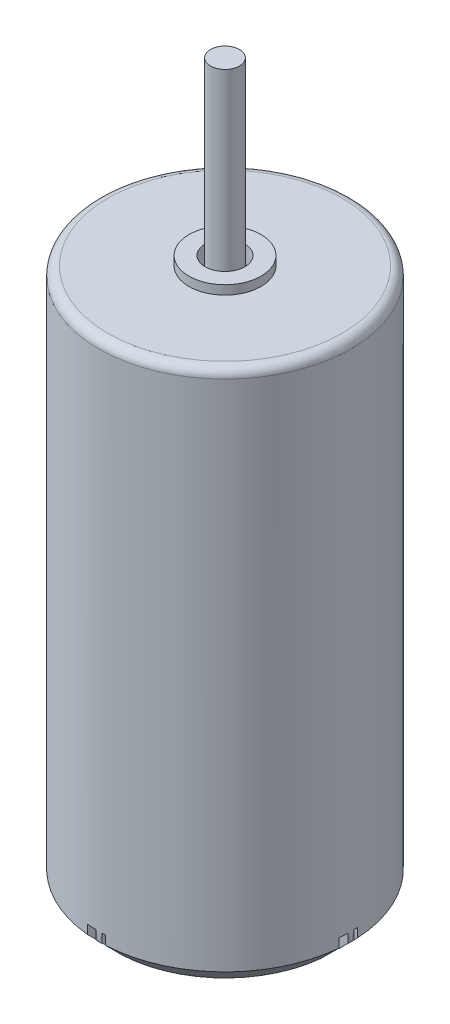
ISO-10303-21;
HEADER;
FILE_DESCRIPTION(('STEP AP214'),'2;1');
FILE_NAME('part.step','',(''),(''),'','','');
FILE_SCHEMA(('AUTOMOTIVE_DESIGN { 1 0 10303 214 1 1 1 1 }'));
ENDSEC;
DATA;
#1=APPLICATION_CONTEXT('core data for automotive mechanical design processes');
#2=APPLICATION_PROTOCOL_DEFINITION('international standard','automotive_design',2000,#1);
#3=PRODUCT_CONTEXT('',#1,'mechanical');
#4=PRODUCT('Part','Part','',(#3));
#5=PRODUCT_RELATED_PRODUCT_CATEGORY('part','',(#4));
#6=PRODUCT_DEFINITION_FORMATION('','',#4);
#7=PRODUCT_DEFINITION_CONTEXT('part definition',#1,'design');
#8=PRODUCT_DEFINITION('design','',#6,#7);
#9=PRODUCT_DEFINITION_SHAPE('','',#8);
#10=(LENGTH_UNIT() NAMED_UNIT(*) SI_UNIT(.MILLI.,.METRE.));
#11=(NAMED_UNIT(*) PLANE_ANGLE_UNIT() SI_UNIT($,.RADIAN.));
#12=(NAMED_UNIT(*) SI_UNIT($,.STERADIAN.) SOLID_ANGLE_UNIT());
#13=UNCERTAINTY_MEASURE_WITH_UNIT(LENGTH_MEASURE(1.E-05),#10,'distance_accuracy_value','');
#14=(GEOMETRIC_REPRESENTATION_CONTEXT(3) GLOBAL_UNCERTAINTY_ASSIGNED_CONTEXT((#13)) GLOBAL_UNIT_ASSIGNED_CONTEXT((#10,
#11,#12)) REPRESENTATION_CONTEXT('',''));
#15=CARTESIAN_POINT('',(0.,0.,0.));
#16=DIRECTION('',(0.,0.,1.));
#17=DIRECTION('',(1.,0.,0.));
#18=AXIS2_PLACEMENT_3D('',#15,#16,#17);
#19=CARTESIAN_POINT('',(0.,0.,0.));
#20=DIRECTION('',(0.,1.,0.));
#21=DIRECTION('',(0.,0.,1.));
#22=AXIS2_PLACEMENT_3D('',#19,#20,#21);
#23=CONICAL_SURFACE('',#22,3.00000000000001,0.785398163397443);
#24=CARTESIAN_POINT('',(0.17527236331454,-1.11823398874989,1.87358557844427));
#25=CARTESIAN_POINT('',(0.175272363314539,-0.858946175686396,2.13393247003533));
#26=CARTESIAN_POINT('',(0.175272363314538,-0.599509125002634,2.39413053381341));
#27=CARTESIAN_POINT('',(0.175272363314537,-0.0804534282997025,2.9143454084042));
#28=CARTESIAN_POINT('',(0.175272363314536,0.179165217688184,3.1743622192481));
#29=CARTESIAN_POINT('',(0.175272363314534,0.635354890827164,3.63113762261169));
#30=CARTESIAN_POINT('',(0.175272363314533,0.83191208048382,3.82791004320748));
#31=CARTESIAN_POINT('',(0.175272363314532,1.22505439379513,4.22142702032182));
#32=CARTESIAN_POINT('',(0.175272363314531,1.42163951745283,4.41817157683734));
#33=CARTESIAN_POINT('',(0.175272363314531,1.61823398874989,4.61490680008847));
#34=B_SPLINE_CURVE_WITH_KNOTS('',3,(#24,#25,#26,#27,#28,#29,#30,#31,#32,#33),.UNSPECIFIED.,.F.,
.F.,(4,2,2,2,4),(0.,1.10231370844078,2.2046272270411,3.03900546012019,3.87338378422473),.UNSPECIFIED.);
#35=CARTESIAN_POINT('',(0.175272363314536,0.,2.99487555645609));
#36=VERTEX_POINT('',#35);
#37=CARTESIAN_POINT('',(0.175272363314535,0.499999999999998,3.49560861634396));
#38=VERTEX_POINT('',#37);
#39=EDGE_CURVE('E633',#36,#38,#34,.T.);
#40=ORIENTED_EDGE('',*,*,#39,.F.);
#41=CARTESIAN_POINT('',(0.,0.,0.));
#42=DIRECTION('',(0.,-1.,0.));
#43=DIRECTION('',(0.,0.,-1.));
#44=AXIS2_PLACEMENT_3D('',#41,#42,#43);
#45=CIRCLE('',#44,3.00000000000001);
#46=CARTESIAN_POINT('',(2.98237354500953,0.,0.324727636685453));
#47=VERTEX_POINT('',#46);
#48=EDGE_CURVE('E516',#47,#36,#45,.T.);
#49=ORIENTED_EDGE('',*,*,#48,.F.);
#50=CARTESIAN_POINT('',(4.6068033533913,1.61823398874989,0.324727636685453));
#51=CARTESIAN_POINT('',(4.37777151372004,1.38978566009453,0.324727636685453));
#52=CARTESIAN_POINT('',(4.14871311811422,1.16136388663444,0.324727636685453));
#53=CARTESIAN_POINT('',(3.69045593135217,0.704662018285365,0.324727636685453));
#54=CARTESIAN_POINT('',(3.46125714043768,0.476381923153808,0.324727636685453));
#55=CARTESIAN_POINT('',(3.00263065589193,0.0200507591434692,0.324727636685453));
#56=CARTESIAN_POINT('',(2.77320296182466,-0.208000309297399,0.324727636685453));
#57=CARTESIAN_POINT('',(2.42870895506907,-0.549722189765074,0.324727636685453));
#58=CARTESIAN_POINT('',(2.31381877268379,-0.663570464169604,0.324727636685453));
#59=CARTESIAN_POINT('',(2.08384315728114,-0.891069865080979,0.324727636685453));
#60=CARTESIAN_POINT('',(1.96875772403218,-1.00472099135367,0.324727636685453));
#61=CARTESIAN_POINT('',(1.85353588664177,-1.11823398874989,0.324727636685453));
#62=B_SPLINE_CURVE_WITH_KNOTS('',3,(#50,#51,#52,#53,#54,#55,#56,#57,#58,#59,#60,#61),
.UNSPECIFIED.,.F.,.F.,(4,2,2,2,2,4),(0.,0.970462841139808,1.94092401607462,2.91138704307374,
3.39661942125925,3.88185237537383),.UNSPECIFIED.);
#63=CARTESIAN_POINT('',(3.48490343653489,0.499999999999999,0.324727636685453));
#64=VERTEX_POINT('',#63);
#65=EDGE_CURVE('E511',#64,#47,#62,.T.);
#66=ORIENTED_EDGE('',*,*,#65,.F.);
#67=CARTESIAN_POINT('',(0.,0.499999999999999,0.));
#68=DIRECTION('',(0.,-1.,0.));
#69=DIRECTION('',(0.,0.,-1.));
#70=AXIS2_PLACEMENT_3D('',#67,#68,#69);
#71=CIRCLE('',#70,3.5);
#72=EDGE_CURVE('E512',#38,#64,#71,.F.);
#73=ORIENTED_EDGE('',*,*,#72,.F.);
#74=EDGE_LOOP('',(#40,#49,#66,#73));
#75=FACE_BOUND('',#74,.T.);
#76=ADVANCED_FACE('F47',(#75),#23,.T.);
#77=CARTESIAN_POINT('',(-0.324727636685469,1.61823398874989,4.6068033533913));
#78=CARTESIAN_POINT('',(-0.324727636685469,1.38978566009453,4.37777151372004));
#79=CARTESIAN_POINT('',(-0.324727636685468,1.16136388663444,4.14871311811422));
#80=CARTESIAN_POINT('',(-0.324727636685466,0.704662018285365,3.69045593135217));
#81=CARTESIAN_POINT('',(-0.324727636685465,0.476381923153809,3.46125714043768));
#82=CARTESIAN_POINT('',(-0.324727636685464,0.0200507591434701,3.00263065589193));
#83=CARTESIAN_POINT('',(-0.324727636685463,-0.208000309297398,2.77320296182466));
#84=CARTESIAN_POINT('',(-0.324727636685462,-0.549722189765073,2.42870895506907));
#85=CARTESIAN_POINT('',(-0.324727636685461,-0.663570464169602,2.31381877268379));
#86=CARTESIAN_POINT('',(-0.324727636685461,-0.891069865080978,2.08384315728114));
#87=CARTESIAN_POINT('',(-0.32472763668546,-1.00472099135367,1.96875772403218));
#88=CARTESIAN_POINT('',(-0.32472763668546,-1.11823398874989,1.85353588664177));
#89=B_SPLINE_CURVE_WITH_KNOTS('',3,(#77,#78,#79,#80,#81,#82,#83,#84,#85,#86,#87,#88),
.UNSPECIFIED.,.F.,.F.,(4,2,2,2,2,4),(0.,0.970462841139808,1.94092401607462,2.91138704307374,
3.39661942125925,3.88185237537383),.UNSPECIFIED.);
#90=CARTESIAN_POINT('',(-0.324727636685465,0.499999999999999,3.48490343653489));
#91=VERTEX_POINT('',#90);
#92=CARTESIAN_POINT('',(-0.324727636685464,0.,2.98237354500953));
#93=VERTEX_POINT('',#92);
#94=EDGE_CURVE('E436',#91,#93,#89,.T.);
#95=ORIENTED_EDGE('',*,*,#94,.F.);
#96=CARTESIAN_POINT('',(-3.49560861634396,0.499999999999999,0.175272363314547));
#97=VERTEX_POINT('',#96);
#98=EDGE_CURVE('E506',#97,#91,#71,.F.);
#99=ORIENTED_EDGE('',*,*,#98,.F.);
#100=CARTESIAN_POINT('',(-1.87358557844427,-1.11823398874989,0.175272363314547));
#101=CARTESIAN_POINT('',(-2.13393247003533,-0.858946175686397,0.175272363314547));
#102=CARTESIAN_POINT('',(-2.39413053381341,-0.599509125002634,0.175272363314547));
#103=CARTESIAN_POINT('',(-2.91434540840419,-0.0804534282997024,0.175272363314547));
#104=CARTESIAN_POINT('',(-3.1743622192481,0.179165217688184,0.175272363314547));
#105=CARTESIAN_POINT('',(-3.63113762261169,0.635354890827164,0.175272363314547));
#106=CARTESIAN_POINT('',(-3.82791004320748,0.831912080483821,0.175272363314547));
#107=CARTESIAN_POINT('',(-4.22142702032182,1.22505439379513,0.175272363314547));
#108=CARTESIAN_POINT('',(-4.41817157683734,1.42163951745283,0.175272363314547));
#109=CARTESIAN_POINT('',(-4.61490680008847,1.61823398874989,0.175272363314547));
#110=B_SPLINE_CURVE_WITH_KNOTS('',3,(#100,#101,#102,#103,#104,#105,#106,#107,#108,#109),
.UNSPECIFIED.,.F.,.F.,(4,2,2,2,4),(0.,1.10231370844078,2.2046272270411,3.03900546012019,
3.87338378422473),.UNSPECIFIED.);
#111=CARTESIAN_POINT('',(-2.99487555645609,0.,0.175272363314547));
#112=VERTEX_POINT('',#111);
#113=EDGE_CURVE('E428',#112,#97,#110,.T.);
#114=ORIENTED_EDGE('',*,*,#113,.F.);
#115=EDGE_CURVE('E700',#93,#112,#45,.T.);
#116=ORIENTED_EDGE('',*,*,#115,.F.);
#117=EDGE_LOOP('',(#95,#99,#114,#116));
#118=FACE_BOUND('',#117,.T.);
#119=ADVANCED_FACE('F456',(#118),#23,.T.);
#120=CARTESIAN_POINT('',(-4.6068033533913,1.61823398874989,-0.324727636685453));
#121=CARTESIAN_POINT('',(-4.37777151372004,1.38978566009453,-0.324727636685453));
#122=CARTESIAN_POINT('',(-4.14871311811422,1.16136388663444,-0.324727636685453));
#123=CARTESIAN_POINT('',(-3.69045593135217,0.704662018285365,-0.324727636685453));
#124=CARTESIAN_POINT('',(-3.46125714043768,0.476381923153808,-0.324727636685453));
#125=CARTESIAN_POINT('',(-3.00263065589193,0.0200507591434692,-0.324727636685453));
#126=CARTESIAN_POINT('',(-2.77320296182466,-0.208000309297399,-0.324727636685453));
#127=CARTESIAN_POINT('',(-2.42870895506907,-0.549722189765074,-0.324727636685453));
#128=CARTESIAN_POINT('',(-2.31381877268379,-0.663570464169604,-0.324727636685453));
#129=CARTESIAN_POINT('',(-2.08384315728114,-0.891069865080979,-0.324727636685453));
#130=CARTESIAN_POINT('',(-1.96875772403218,-1.00472099135367,-0.324727636685453));
#131=CARTESIAN_POINT('',(-1.85353588664177,-1.11823398874989,-0.324727636685453));
#132=B_SPLINE_CURVE_WITH_KNOTS('',3,(#120,#121,#122,#123,#124,#125,#126,#127,#128,#129,#130,
#131),.UNSPECIFIED.,.F.,.F.,(4,2,2,2,2,4),(0.,0.970462841139808,1.94092401607462,
2.91138704307374,3.39661942125925,3.88185237537383),.UNSPECIFIED.);
#133=CARTESIAN_POINT('',(-3.48490343653489,0.499999999999999,-0.324727636685453));
#134=VERTEX_POINT('',#133);
#135=CARTESIAN_POINT('',(-2.98237354500953,0.,-0.324727636685453));
#136=VERTEX_POINT('',#135);
#137=EDGE_CURVE('E421',#134,#136,#132,.T.);
#138=ORIENTED_EDGE('',*,*,#137,.F.);
#139=CARTESIAN_POINT('',(-0.17527236331451,0.499999999999999,-3.49560861634396));
#140=VERTEX_POINT('',#139);
#141=EDGE_CURVE('E494',#140,#134,#71,.F.);
#142=ORIENTED_EDGE('',*,*,#141,.F.);
#143=CARTESIAN_POINT('',(-0.175272363314527,-1.11823398874989,-1.87358557844427));
#144=CARTESIAN_POINT('',(-0.175272363314524,-0.858946175686397,-2.13393247003533));
#145=CARTESIAN_POINT('',(-0.175272363314522,-0.599509125002634,-2.39413053381341));
#146=CARTESIAN_POINT('',(-0.175272363314516,-0.0804534282997023,-2.9143454084042));
#147=CARTESIAN_POINT('',(-0.175272363314514,0.179165217688184,-3.1743622192481));
#148=CARTESIAN_POINT('',(-0.175272363314509,0.635354890827164,-3.6311376226117));
#149=CARTESIAN_POINT('',(-0.175272363314507,0.831912080483821,-3.82791004320748));
#150=CARTESIAN_POINT('',(-0.175272363314503,1.22505439379513,-4.22142702032183));
#151=CARTESIAN_POINT('',(-0.1752723633145,1.42163951745283,-4.41817157683735));
#152=CARTESIAN_POINT('',(-0.175272363314498,1.61823398874989,-4.61490680008847));
#153=B_SPLINE_CURVE_WITH_KNOTS('',3,(#143,#144,#145,#146,#147,#148,#149,#150,#151,#152),
.UNSPECIFIED.,.F.,.F.,(4,2,2,2,4),(0.,1.10231370844078,2.2046272270411,3.03900546012019,
3.87338378422473),.UNSPECIFIED.);
#154=CARTESIAN_POINT('',(-0.175272363314515,0.,-2.99487555645609));
#155=VERTEX_POINT('',#154);
#156=EDGE_CURVE('E406',#155,#140,#153,.T.);
#157=ORIENTED_EDGE('',*,*,#156,.F.);
#158=EDGE_CURVE('E496',#136,#155,#45,.T.);
#159=ORIENTED_EDGE('',*,*,#158,.F.);
#160=EDGE_LOOP('',(#138,#142,#157,#159));
#161=FACE_BOUND('',#160,.T.);
#162=ADVANCED_FACE('F462',(#161),#23,.T.);
#163=CARTESIAN_POINT('',(3.5,0.,0.));
#164=DIRECTION('',(0.,-1.,0.));
#165=DIRECTION('',(0.,0.,-1.));
#166=AXIS2_PLACEMENT_3D('',#163,#164,#165);
#167=PLANE('',#166);
#168=DIRECTION('',(0.,0.,1.));
#169=VECTOR('',#168,1.);
#170=CARTESIAN_POINT('',(0.175272363314538,0.,2.49906915230633));
#171=LINE('',#170,#169);
#172=CARTESIAN_POINT('',(0.175272363314538,0.,2.49906915230633));
#173=VERTEX_POINT('',#172);
#174=EDGE_CURVE('E276',#173,#36,#171,.T.);
#175=ORIENTED_EDGE('',*,*,#174,.F.);
#176=DIRECTION('',(1.,0.,0.));
#177=VECTOR('',#176,1.);
#178=CARTESIAN_POINT('',(-0.324727636685462,0.,2.49906915230633));
#179=LINE('',#178,#177);
#180=CARTESIAN_POINT('',(-0.324727636685462,0.,2.49906915230633));
#181=VERTEX_POINT('',#180);
#182=EDGE_CURVE('E272',#181,#173,#179,.T.);
#183=ORIENTED_EDGE('',*,*,#182,.F.);
#184=DIRECTION('',(0.,0.,-1.));
#185=VECTOR('',#184,1.);
#186=CARTESIAN_POINT('',(-0.324727636685462,0.,2.49906915230633));
#187=LINE('',#186,#185);
#188=EDGE_CURVE('E255',#93,#181,#187,.T.);
#189=ORIENTED_EDGE('',*,*,#188,.F.);
#190=ORIENTED_EDGE('',*,*,#115,.T.);
#191=DIRECTION('',(-1.,0.,0.));
#192=VECTOR('',#191,1.);
#193=CARTESIAN_POINT('',(-2.49906915230633,0.,0.175272363314547));
#194=LINE('',#193,#192);
#195=CARTESIAN_POINT('',(-2.49906915230633,0.,0.175272363314547));
#196=VERTEX_POINT('',#195);
#197=EDGE_CURVE('E287',#196,#112,#194,.T.);
#198=ORIENTED_EDGE('',*,*,#197,.F.);
#199=DIRECTION('',(0.,0.,1.));
#200=VECTOR('',#199,1.);
#201=CARTESIAN_POINT('',(-2.49906915230633,0.,-0.324727636685453));
#202=LINE('',#201,#200);
#203=CARTESIAN_POINT('',(-2.49906915230633,0.,-0.324727636685453));
#204=VERTEX_POINT('',#203);
#205=EDGE_CURVE('E302',#204,#196,#202,.T.);
#206=ORIENTED_EDGE('',*,*,#205,.F.);
#207=DIRECTION('',(1.,0.,0.));
#208=VECTOR('',#207,1.);
#209=CARTESIAN_POINT('',(-2.49906915230633,0.,-0.324727636685453));
#210=LINE('',#209,#208);
#211=EDGE_CURVE('E299',#136,#204,#210,.T.);
#212=ORIENTED_EDGE('',*,*,#211,.F.);
#213=ORIENTED_EDGE('',*,*,#158,.T.);
#214=DIRECTION('',(0.,0.,-1.));
#215=VECTOR('',#214,1.);
#216=CARTESIAN_POINT('',(-0.175272363314521,0.,-2.49906915230633));
#217=LINE('',#216,#215);
#218=CARTESIAN_POINT('',(-0.175272363314521,0.,-2.49906915230633));
#219=VERTEX_POINT('',#218);
#220=EDGE_CURVE('E319',#219,#155,#217,.T.);
#221=ORIENTED_EDGE('',*,*,#220,.F.);
#222=DIRECTION('',(-1.,0.,0.));
#223=VECTOR('',#222,1.);
#224=CARTESIAN_POINT('',(0.324727636685479,0.,-2.49906915230633));
#225=LINE('',#224,#223);
#226=CARTESIAN_POINT('',(0.324727636685479,0.,-2.49906915230633));
#227=VERTEX_POINT('',#226);
#228=EDGE_CURVE('E334',#227,#219,#225,.T.);
#229=ORIENTED_EDGE('',*,*,#228,.F.);
#230=DIRECTION('',(0.,0.,1.));
#231=VECTOR('',#230,1.);
#232=CARTESIAN_POINT('',(0.324727636685479,0.,-2.49906915230633));
#233=LINE('',#232,#231);
#234=CARTESIAN_POINT('',(0.324727636685484,0.,-2.98237354500953));
#235=VERTEX_POINT('',#234);
#236=EDGE_CURVE('E331',#235,#227,#233,.T.);
#237=ORIENTED_EDGE('',*,*,#236,.F.);
#238=CARTESIAN_POINT('',(2.99487555645609,0.,-0.175272363314547));
#239=VERTEX_POINT('',#238);
#240=EDGE_CURVE('E688',#235,#239,#45,.T.);
#241=ORIENTED_EDGE('',*,*,#240,.T.);
#242=DIRECTION('',(1.,0.,0.));
#243=VECTOR('',#242,1.);
#244=CARTESIAN_POINT('',(2.49906915230633,0.,-0.175272363314547));
#245=LINE('',#244,#243);
#246=CARTESIAN_POINT('',(2.49906915230633,0.,-0.175272363314547));
#247=VERTEX_POINT('',#246);
#248=EDGE_CURVE('E577',#247,#239,#245,.T.);
#249=ORIENTED_EDGE('',*,*,#248,.F.);
#250=DIRECTION('',(0.,0.,-1.));
#251=VECTOR('',#250,1.);
#252=CARTESIAN_POINT('',(2.49906915230633,0.,0.324727636685453));
#253=LINE('',#252,#251);
#254=CARTESIAN_POINT('',(2.49906915230633,0.,0.324727636685453));
#255=VERTEX_POINT('',#254);
#256=EDGE_CURVE('E582',#255,#247,#253,.T.);
#257=ORIENTED_EDGE('',*,*,#256,.F.);
#258=DIRECTION('',(-1.,0.,0.));
#259=VECTOR('',#258,1.);
#260=CARTESIAN_POINT('',(2.49906915230633,0.,0.324727636685453));
#261=LINE('',#260,#259);
#262=EDGE_CURVE('E586',#47,#255,#261,.T.);
#263=ORIENTED_EDGE('',*,*,#262,.F.);
#264=ORIENTED_EDGE('',*,*,#48,.T.);
#265=EDGE_LOOP('',(#175,#183,#189,#190,#198,#206,#212,#213,#221,#229,#237,#241,#249,#257,#263,#264));
#266=FACE_BOUND('',#265,.T.);
#267=ADVANCED_FACE('F482',(#266),#167,.T.);
#268=CARTESIAN_POINT('',(0.,20.,0.));
#269=DIRECTION('',(0.,1.,0.));
#270=DIRECTION('',(0.,0.,1.));
#271=AXIS2_PLACEMENT_3D('',#268,#269,#270);
#272=PLANE('',#271);
#273=CARTESIAN_POINT('',(0.,20.,0.));
#274=DIRECTION('',(0.,-1.,0.));
#275=DIRECTION('',(0.,0.,-1.));
#276=AXIS2_PLACEMENT_3D('',#273,#274,#275);
#277=CIRCLE('',#276,0.4);
#278=CARTESIAN_POINT('',(0.,20.,-0.4));
#279=VERTEX_POINT('',#278);
#280=EDGE_CURVE('E747',#279,#279,#277,.T.);
#281=ORIENTED_EDGE('',*,*,#280,.F.);
#282=EDGE_LOOP('',(#281));
#283=FACE_BOUND('',#282,.T.);
#284=ADVANCED_FACE('F487',(#283),#272,.T.);
#285=CARTESIAN_POINT('',(0.,0.,0.));
#286=DIRECTION('',(0.,-1.,0.));
#287=DIRECTION('',(0.,0.,-1.));
#288=AXIS2_PLACEMENT_3D('',#285,#286,#287);
#289=CYLINDRICAL_SURFACE('',#288,0.400000000000001);
#290=ORIENTED_EDGE('',*,*,#280,.T.);
#291=EDGE_LOOP('',(#290));
#292=FACE_BOUND('',#291,.T.);
#293=CARTESIAN_POINT('',(0.,14.75,0.));
#294=DIRECTION('',(0.,-1.,0.));
#295=DIRECTION('',(0.,0.,-1.));
#296=AXIS2_PLACEMENT_3D('',#293,#294,#295);
#297=CIRCLE('',#296,0.400000000000001);
#298=CARTESIAN_POINT('',(0.,14.75,-0.400000000000001));
#299=VERTEX_POINT('',#298);
#300=EDGE_CURVE('E743',#299,#299,#297,.T.);
#301=ORIENTED_EDGE('',*,*,#300,.F.);
#302=EDGE_LOOP('',(#301));
#303=FACE_BOUND('',#302,.T.);
#304=ADVANCED_FACE('F778',(#292,#303),#289,.T.);
#305=CARTESIAN_POINT('',(0.400000000000001,14.75,0.));
#306=DIRECTION('',(0.,1.,0.));
#307=DIRECTION('',(0.,0.,1.));
#308=AXIS2_PLACEMENT_3D('',#305,#306,#307);
#309=PLANE('',#308);
#310=ORIENTED_EDGE('',*,*,#300,.T.);
#311=EDGE_LOOP('',(#310));
#312=FACE_BOUND('',#311,.T.);
#313=CARTESIAN_POINT('',(0.,14.75,0.));
#314=DIRECTION('',(0.,-1.,0.));
#315=DIRECTION('',(0.,0.,-1.));
#316=AXIS2_PLACEMENT_3D('',#313,#314,#315);
#317=CIRCLE('',#316,0.550000000000001);
#318=CARTESIAN_POINT('',(0.,14.75,-0.550000000000001));
#319=VERTEX_POINT('',#318);
#320=EDGE_CURVE('E739',#319,#319,#317,.T.);
#321=ORIENTED_EDGE('',*,*,#320,.F.);
#322=EDGE_LOOP('',(#321));
#323=FACE_BOUND('',#322,.T.);
#324=ADVANCED_FACE('F774',(#312,#323),#309,.T.);
#325=CARTESIAN_POINT('',(0.,0.,0.));
#326=DIRECTION('',(0.,-1.,0.));
#327=DIRECTION('',(0.,0.,-1.));
#328=AXIS2_PLACEMENT_3D('',#325,#326,#327);
#329=CYLINDRICAL_SURFACE('',#328,0.550000000000001);
#330=ORIENTED_EDGE('',*,*,#320,.T.);
#331=EDGE_LOOP('',(#330));
#332=FACE_BOUND('',#331,.T.);
#333=CARTESIAN_POINT('',(0.,15.25,0.));
#334=DIRECTION('',(0.,-1.,0.));
#335=DIRECTION('',(0.,0.,-1.));
#336=AXIS2_PLACEMENT_3D('',#333,#334,#335);
#337=CIRCLE('',#336,0.550000000000001);
#338=CARTESIAN_POINT('',(0.,15.25,-0.550000000000001));
#339=VERTEX_POINT('',#338);
#340=EDGE_CURVE('E733',#339,#339,#337,.T.);
#341=ORIENTED_EDGE('',*,*,#340,.F.);
#342=EDGE_LOOP('',(#341));
#343=FACE_BOUND('',#342,.T.);
#344=ADVANCED_FACE('F770',(#332,#343),#329,.F.);
#345=CARTESIAN_POINT('',(0.550000000000001,15.25,0.));
#346=DIRECTION('',(0.,1.,0.));
#347=DIRECTION('',(0.,0.,1.));
#348=AXIS2_PLACEMENT_3D('',#345,#346,#347);
#349=PLANE('',#348);
#350=ORIENTED_EDGE('',*,*,#340,.T.);
#351=EDGE_LOOP('',(#350));
#352=FACE_BOUND('',#351,.T.);
#353=CARTESIAN_POINT('',(0.,15.25,0.));
#354=DIRECTION('',(0.,-1.,0.));
#355=DIRECTION('',(0.,0.,-1.));
#356=AXIS2_PLACEMENT_3D('',#353,#354,#355);
#357=CIRCLE('',#356,1.);
#358=CARTESIAN_POINT('',(0.,15.25,-1.));
#359=VERTEX_POINT('',#358);
#360=EDGE_CURVE('E728',#359,#359,#357,.T.);
#361=ORIENTED_EDGE('',*,*,#360,.F.);
#362=EDGE_LOOP('',(#361));
#363=FACE_BOUND('',#362,.T.);
#364=ADVANCED_FACE('F764',(#352,#363),#349,.T.);
#365=CARTESIAN_POINT('',(0.,0.,0.));
#366=DIRECTION('',(0.,-1.,0.));
#367=DIRECTION('',(0.,0.,-1.));
#368=AXIS2_PLACEMENT_3D('',#365,#366,#367);
#369=CYLINDRICAL_SURFACE('',#368,1.);
#370=ORIENTED_EDGE('',*,*,#360,.T.);
#371=EDGE_LOOP('',(#370));
#372=FACE_BOUND('',#371,.T.);
#373=CARTESIAN_POINT('',(0.,15.,0.));
#374=DIRECTION('',(0.,-1.,0.));
#375=DIRECTION('',(0.,0.,-1.));
#376=AXIS2_PLACEMENT_3D('',#373,#374,#375);
#377=CIRCLE('',#376,1.);
#378=CARTESIAN_POINT('',(0.,15.,-1.));
#379=VERTEX_POINT('',#378);
#380=EDGE_CURVE('E725',#379,#379,#377,.T.);
#381=ORIENTED_EDGE('',*,*,#380,.F.);
#382=EDGE_LOOP('',(#381));
#383=FACE_BOUND('',#382,.T.);
#384=ADVANCED_FACE('F759',(#372,#383),#369,.T.);
#385=CARTESIAN_POINT('',(1.,15.,0.));
#386=DIRECTION('',(0.,1.,0.));
#387=DIRECTION('',(0.,0.,1.));
#388=AXIS2_PLACEMENT_3D('',#385,#386,#387);
#389=PLANE('',#388);
#390=CARTESIAN_POINT('',(0.,15.,0.));
#391=DIRECTION('',(0.,1.,0.));
#392=DIRECTION('',(0.,0.,1.));
#393=AXIS2_PLACEMENT_3D('',#390,#391,#392);
#394=CIRCLE('',#393,3.25);
#395=CARTESIAN_POINT('',(0.,15.,3.25));
#396=VERTEX_POINT('',#395);
#397=EDGE_CURVE('E704',#396,#396,#394,.T.);
#398=ORIENTED_EDGE('',*,*,#397,.T.);
#399=EDGE_LOOP('',(#398));
#400=FACE_BOUND('',#399,.T.);
#401=ORIENTED_EDGE('',*,*,#380,.T.);
#402=EDGE_LOOP('',(#401));
#403=FACE_BOUND('',#402,.T.);
#404=ADVANCED_FACE('F755',(#400,#403),#389,.T.);
#405=CARTESIAN_POINT('',(0.,0.,0.));
#406=DIRECTION('',(0.,-1.,0.));
#407=DIRECTION('',(0.,0.,-1.));
#408=AXIS2_PLACEMENT_3D('',#405,#406,#407);
#409=CYLINDRICAL_SURFACE('',#408,3.5);
#410=DIRECTION('',(0.,-1.,0.));
#411=VECTOR('',#410,1.);
#412=CARTESIAN_POINT('',(-0.0807159673066351,0.,3.49906915230633));
#413=LINE('',#412,#411);
#414=CARTESIAN_POINT('',(-0.0807159673066351,0.499999999999998,3.49906915230633));
#415=VERTEX_POINT('',#414);
#416=CARTESIAN_POINT('',(-0.0807159673066351,0.75,3.49906915230633));
#417=VERTEX_POINT('',#416);
#418=EDGE_CURVE('E589',#415,#417,#413,.F.);
#419=ORIENTED_EDGE('',*,*,#418,.F.);
#420=CARTESIAN_POINT('',(0.,0.499999999999999,0.));
#421=DIRECTION('',(0.,1.,0.));
#422=DIRECTION('',(-0.0230617049447523,0.,0.999734043516095));
#423=AXIS2_PLACEMENT_3D('',#420,#421,#422);
#424=CIRCLE('',#423,3.5);
#425=CARTESIAN_POINT('',(0.0807159673066154,0.499999999999729,3.49906915230633));
#426=VERTEX_POINT('',#425);
#427=EDGE_CURVE('E632',#415,#426,#424,.T.);
#428=ORIENTED_EDGE('',*,*,#427,.T.);
#429=DIRECTION('',(0.,-1.,0.));
#430=VECTOR('',#429,1.);
#431=CARTESIAN_POINT('',(0.0807159673066107,0.,3.49906915230633));
#432=LINE('',#431,#430);
#433=CARTESIAN_POINT('',(0.0807159673066107,0.75,3.49906915230633));
#434=VERTEX_POINT('',#433);
#435=EDGE_CURVE('E606',#434,#426,#432,.T.);
#436=ORIENTED_EDGE('',*,*,#435,.F.);
#437=CARTESIAN_POINT('',(0.,0.75,0.));
#438=DIRECTION('',(0.,-1.,0.));
#439=DIRECTION('',(0.,0.,-1.));
#440=AXIS2_PLACEMENT_3D('',#437,#438,#439);
#441=CIRCLE('',#440,3.5);
#442=CARTESIAN_POINT('',(0.175272363314535,0.75,3.49560861634396));
#443=VERTEX_POINT('',#442);
#444=EDGE_CURVE('E61',#434,#443,#441,.F.);
#445=ORIENTED_EDGE('',*,*,#444,.T.);
#446=DIRECTION('',(0.,-1.,0.));
#447=VECTOR('',#446,1.);
#448=CARTESIAN_POINT('',(0.175272363314535,0.,3.49560861634396));
#449=LINE('',#448,#447);
#450=EDGE_CURVE('E715',#38,#443,#449,.F.);
#451=ORIENTED_EDGE('',*,*,#450,.F.);
#452=ORIENTED_EDGE('',*,*,#72,.T.);
#453=DIRECTION('',(0.,-1.,0.));
#454=VECTOR('',#453,1.);
#455=CARTESIAN_POINT('',(3.48490343653489,0.,0.324727636685453));
#456=LINE('',#455,#454);
#457=CARTESIAN_POINT('',(3.48490343653489,0.75,0.324727636685453));
#458=VERTEX_POINT('',#457);
#459=EDGE_CURVE('E565',#458,#64,#456,.T.);
#460=ORIENTED_EDGE('',*,*,#459,.F.);
#461=CARTESIAN_POINT('',(0.,0.75,0.));
#462=DIRECTION('',(0.,-1.,0.));
#463=DIRECTION('',(0.,0.,-1.));
#464=AXIS2_PLACEMENT_3D('',#461,#462,#463);
#465=CIRCLE('',#464,3.5);
#466=CARTESIAN_POINT('',(3.49906915230633,0.75,0.0807159673066229));
#467=VERTEX_POINT('',#466);
#468=EDGE_CURVE('E671',#458,#467,#465,.F.);
#469=ORIENTED_EDGE('',*,*,#468,.T.);
#470=DIRECTION('',(0.,-1.,0.));
#471=VECTOR('',#470,1.);
#472=CARTESIAN_POINT('',(3.49906915230633,0.,0.0807159673066229));
#473=LINE('',#472,#471);
#474=CARTESIAN_POINT('',(3.49906915230633,0.499999999999999,0.0807159673066229));
#475=VERTEX_POINT('',#474);
#476=EDGE_CURVE('E557',#475,#467,#473,.F.);
#477=ORIENTED_EDGE('',*,*,#476,.F.);
#478=CARTESIAN_POINT('',(0.,0.499999999999999,0.));
#479=DIRECTION('',(0.,1.,0.));
#480=DIRECTION('',(0.999734043516095,0.,0.0230617049447495));
#481=AXIS2_PLACEMENT_3D('',#478,#479,#480);
#482=CIRCLE('',#481,3.5);
#483=CARTESIAN_POINT('',(3.49906915230633,0.49999999999973,-0.0807159673066276));
#484=VERTEX_POINT('',#483);
#485=EDGE_CURVE('E677',#475,#484,#482,.T.);
#486=ORIENTED_EDGE('',*,*,#485,.T.);
#487=DIRECTION('',(0.,-1.,0.));
#488=VECTOR('',#487,1.);
#489=CARTESIAN_POINT('',(3.49906915230633,0.,-0.0807159673066229));
#490=LINE('',#489,#488);
#491=CARTESIAN_POINT('',(3.49906915230633,0.75,-0.0807159673066229));
#492=VERTEX_POINT('',#491);
#493=EDGE_CURVE('E548',#492,#484,#490,.T.);
#494=ORIENTED_EDGE('',*,*,#493,.F.);
#495=CARTESIAN_POINT('',(3.49560861634396,0.75,-0.175272363314547));
#496=VERTEX_POINT('',#495);
#497=EDGE_CURVE('E674',#492,#496,#465,.F.);
#498=ORIENTED_EDGE('',*,*,#497,.T.);
#499=DIRECTION('',(0.,-1.,0.));
#500=VECTOR('',#499,1.);
#501=CARTESIAN_POINT('',(3.49560861634396,0.,-0.175272363314547));
#502=LINE('',#501,#500);
#503=CARTESIAN_POINT('',(3.49560861634396,0.499999999999999,-0.175272363314547));
#504=VERTEX_POINT('',#503);
#505=EDGE_CURVE('E558',#504,#496,#502,.F.);
#506=ORIENTED_EDGE('',*,*,#505,.F.);
#507=CARTESIAN_POINT('',(0.32472763668549,0.499999999999999,-3.48490343653489));
#508=VERTEX_POINT('',#507);
#509=EDGE_CURVE('E505',#504,#508,#71,.F.);
#510=ORIENTED_EDGE('',*,*,#509,.T.);
#511=DIRECTION('',(0.,-1.,0.));
#512=VECTOR('',#511,1.);
#513=CARTESIAN_POINT('',(0.32472763668549,0.,-3.48490343653489));
#514=LINE('',#513,#512);
#515=CARTESIAN_POINT('',(0.32472763668549,0.75,-3.48490343653489));
#516=VERTEX_POINT('',#515);
#517=EDGE_CURVE('E280',#516,#508,#514,.T.);
#518=ORIENTED_EDGE('',*,*,#517,.F.);
#519=CARTESIAN_POINT('',(0.,0.75,0.));
#520=DIRECTION('',(0.,-1.,0.));
#521=DIRECTION('',(0.,0.,-1.));
#522=AXIS2_PLACEMENT_3D('',#519,#520,#521);
#523=CIRCLE('',#522,3.5);
#524=CARTESIAN_POINT('',(0.0807159673066595,0.75,-3.49906915230633));
#525=VERTEX_POINT('',#524);
#526=EDGE_CURVE('E621',#516,#525,#523,.F.);
#527=ORIENTED_EDGE('',*,*,#526,.T.);
#528=DIRECTION('',(0.,-1.,0.));
#529=VECTOR('',#528,1.);
#530=CARTESIAN_POINT('',(0.0807159673066595,0.,-3.49906915230633));
#531=LINE('',#530,#529);
#532=CARTESIAN_POINT('',(0.0807159673066595,0.499999999999999,-3.49906915230633));
#533=VERTEX_POINT('',#532);
#534=EDGE_CURVE('E359',#533,#525,#531,.F.);
#535=ORIENTED_EDGE('',*,*,#534,.F.);
#536=CARTESIAN_POINT('',(0.,0.499999999999999,0.));
#537=DIRECTION('',(0.,1.,0.));
#538=DIRECTION('',(0.0230617049447595,0.,-0.999734043516095));
#539=AXIS2_PLACEMENT_3D('',#536,#537,#538);
#540=CIRCLE('',#539,3.5);
#541=CARTESIAN_POINT('',(-0.080715967306591,0.49999999999973,-3.49906915230633));
#542=VERTEX_POINT('',#541);
#543=EDGE_CURVE('E414',#533,#542,#540,.T.);
#544=ORIENTED_EDGE('',*,*,#543,.T.);
#545=DIRECTION('',(0.,-1.,0.));
#546=VECTOR('',#545,1.);
#547=CARTESIAN_POINT('',(-0.0807159673065862,0.,-3.49906915230633));
#548=LINE('',#547,#546);
#549=CARTESIAN_POINT('',(-0.0807159673065862,0.75,-3.49906915230633));
#550=VERTEX_POINT('',#549);
#551=EDGE_CURVE('E350',#550,#542,#548,.T.);
#552=ORIENTED_EDGE('',*,*,#551,.F.);
#553=CARTESIAN_POINT('',(-0.17527236331451,0.75,-3.49560861634396));
#554=VERTEX_POINT('',#553);
#555=EDGE_CURVE('E625',#550,#554,#523,.F.);
#556=ORIENTED_EDGE('',*,*,#555,.T.);
#557=DIRECTION('',(0.,-1.,0.));
#558=VECTOR('',#557,1.);
#559=CARTESIAN_POINT('',(-0.17527236331451,0.,-3.49560861634396));
#560=LINE('',#559,#558);
#561=EDGE_CURVE('E347',#140,#554,#560,.F.);
#562=ORIENTED_EDGE('',*,*,#561,.F.);
#563=ORIENTED_EDGE('',*,*,#141,.T.);
#564=DIRECTION('',(0.,-1.,0.));
#565=VECTOR('',#564,1.);
#566=CARTESIAN_POINT('',(-3.48490343653489,0.,-0.324727636685453));
#567=LINE('',#566,#565);
#568=CARTESIAN_POINT('',(-3.48490343653489,0.75,-0.324727636685453));
#569=VERTEX_POINT('',#568);
#570=EDGE_CURVE('E77',#569,#134,#567,.T.);
#571=ORIENTED_EDGE('',*,*,#570,.F.);
#572=CARTESIAN_POINT('',(0.,0.75,0.));
#573=DIRECTION('',(0.,-1.,0.));
#574=DIRECTION('',(0.,0.,-1.));
#575=AXIS2_PLACEMENT_3D('',#572,#573,#574);
#576=CIRCLE('',#575,3.5);
#577=CARTESIAN_POINT('',(-3.49906915230633,0.75,-0.0807159673066229));
#578=VERTEX_POINT('',#577);
#579=EDGE_CURVE('E630',#569,#578,#576,.F.);
#580=ORIENTED_EDGE('',*,*,#579,.T.);
#581=DIRECTION('',(0.,-1.,0.));
#582=VECTOR('',#581,1.);
#583=CARTESIAN_POINT('',(-3.49906915230633,0.,-0.0807159673066229));
#584=LINE('',#583,#582);
#585=CARTESIAN_POINT('',(-3.49906915230633,0.499999999999999,-0.0807159673066229));
#586=VERTEX_POINT('',#585);
#587=EDGE_CURVE('E1004',#586,#578,#584,.F.);
#588=ORIENTED_EDGE('',*,*,#587,.F.);
#589=CARTESIAN_POINT('',(0.,0.499999999999999,0.));
#590=DIRECTION('',(0.,1.,0.));
#591=DIRECTION('',(-0.999734043516095,0.,-0.0230617049447496));
#592=AXIS2_PLACEMENT_3D('',#589,#590,#591);
#593=CIRCLE('',#592,3.5);
#594=CARTESIAN_POINT('',(-3.49906915230633,0.49999999999973,0.0807159673066276));
#595=VERTEX_POINT('',#594);
#596=EDGE_CURVE('E369',#586,#595,#593,.T.);
#597=ORIENTED_EDGE('',*,*,#596,.T.);
#598=DIRECTION('',(0.,-1.,0.));
#599=VECTOR('',#598,1.);
#600=CARTESIAN_POINT('',(-3.49906915230633,0.,0.0807159673066229));
#601=LINE('',#600,#599);
#602=CARTESIAN_POINT('',(-3.49906915230633,0.75,0.0807159673066229));
#603=VERTEX_POINT('',#602);
#604=EDGE_CURVE('E375',#603,#595,#601,.T.);
#605=ORIENTED_EDGE('',*,*,#604,.F.);
#606=CARTESIAN_POINT('',(-3.49560861634396,0.75,0.175272363314547));
#607=VERTEX_POINT('',#606);
#608=EDGE_CURVE('E624',#603,#607,#576,.F.);
#609=ORIENTED_EDGE('',*,*,#608,.T.);
#610=DIRECTION('',(0.,-1.,0.));
#611=VECTOR('',#610,1.);
#612=CARTESIAN_POINT('',(-3.49560861634396,0.,0.175272363314547));
#613=LINE('',#612,#611);
#614=EDGE_CURVE('E1018',#97,#607,#613,.F.);
#615=ORIENTED_EDGE('',*,*,#614,.F.);
#616=ORIENTED_EDGE('',*,*,#98,.T.);
#617=DIRECTION('',(0.,-1.,0.));
#618=VECTOR('',#617,1.);
#619=CARTESIAN_POINT('',(-0.324727636685465,0.,3.48490343653489));
#620=LINE('',#619,#618);
#621=CARTESIAN_POINT('',(-0.324727636685465,0.75,3.48490343653489));
#622=VERTEX_POINT('',#621);
#623=EDGE_CURVE('E69',#622,#91,#620,.T.);
#624=ORIENTED_EDGE('',*,*,#623,.F.);
#625=EDGE_CURVE('E11',#622,#417,#441,.F.);
#626=ORIENTED_EDGE('',*,*,#625,.T.);
#627=EDGE_LOOP('',(#419,#428,#436,#445,#451,#452,#460,#469,#477,#486,#494,#498,#506,#510,#518,
#527,#535,#544,#552,#556,#562,#563,#571,#580,#588,#597,#605,#609,#615,#616,#624,#626));
#628=FACE_BOUND('',#627,.T.);
#629=CARTESIAN_POINT('',(0.,14.75,0.));
#630=DIRECTION('',(0.,1.,0.));
#631=DIRECTION('',(0.,0.,1.));
#632=AXIS2_PLACEMENT_3D('',#629,#630,#631);
#633=CIRCLE('',#632,3.5);
#634=CARTESIAN_POINT('',(0.,14.75,3.5));
#635=VERTEX_POINT('',#634);
#636=EDGE_CURVE('E707',#635,#635,#633,.F.);
#637=ORIENTED_EDGE('',*,*,#636,.T.);
#638=EDGE_LOOP('',(#637));
#639=FACE_BOUND('',#638,.T.);
#640=ADVANCED_FACE('F478',(#628,#639),#409,.T.);
#641=CARTESIAN_POINT('',(0.,14.75,0.));
#642=DIRECTION('',(0.,1.,0.));
#643=DIRECTION('',(0.,0.,1.));
#644=AXIS2_PLACEMENT_3D('',#641,#642,#643);
#645=TOROIDAL_SURFACE('',#644,3.25,0.25);
#646=ORIENTED_EDGE('',*,*,#397,.F.);
#647=EDGE_LOOP('',(#646));
#648=FACE_BOUND('',#647,.T.);
#649=ORIENTED_EDGE('',*,*,#636,.F.);
#650=EDGE_LOOP('',(#649));
#651=FACE_BOUND('',#650,.T.);
#652=ADVANCED_FACE('F467',(#648,#651),#645,.T.);
#653=CARTESIAN_POINT('',(0.324727636685501,1.61823398874989,-4.6068033533913));
#654=CARTESIAN_POINT('',(0.324727636685499,1.38978566009453,-4.37777151372004));
#655=CARTESIAN_POINT('',(0.324727636685497,1.16136388663444,-4.14871311811421));
#656=CARTESIAN_POINT('',(0.324727636685492,0.704662018285365,-3.69045593135217));
#657=CARTESIAN_POINT('',(0.324727636685489,0.476381923153808,-3.46125714043767));
#658=CARTESIAN_POINT('',(0.324727636685485,0.0200507591434691,-3.00263065589192));
#659=CARTESIAN_POINT('',(0.324727636685482,-0.208000309297399,-2.77320296182466));
#660=CARTESIAN_POINT('',(0.324727636685479,-0.549722189765074,-2.42870895506907));
#661=CARTESIAN_POINT('',(0.324727636685477,-0.663570464169604,-2.31381877268379));
#662=CARTESIAN_POINT('',(0.324727636685475,-0.89106986508098,-2.08384315728113));
#663=CARTESIAN_POINT('',(0.324727636685474,-1.00472099135367,-1.96875772403217));
#664=CARTESIAN_POINT('',(0.324727636685473,-1.11823398874989,-1.85353588664176));
#665=B_SPLINE_CURVE_WITH_KNOTS('',3,(#653,#654,#655,#656,#657,#658,#659,#660,#661,#662,#663,
#664),.UNSPECIFIED.,.F.,.F.,(4,2,2,2,2,4),(0.,0.970462841139808,1.94092401607462,
2.91138704307374,3.39661942125925,3.88185237537383),.UNSPECIFIED.);
#666=EDGE_CURVE('E415',#508,#235,#665,.T.);
#667=ORIENTED_EDGE('',*,*,#666,.F.);
#668=ORIENTED_EDGE('',*,*,#509,.F.);
#669=CARTESIAN_POINT('',(1.87358557844427,-1.11823398874989,-0.175272363314547));
#670=CARTESIAN_POINT('',(2.13393247003533,-0.858946175686397,-0.175272363314547));
#671=CARTESIAN_POINT('',(2.39413053381341,-0.599509125002634,-0.175272363314547));
#672=CARTESIAN_POINT('',(2.91434540840419,-0.0804534282997025,-0.175272363314547));
#673=CARTESIAN_POINT('',(3.1743622192481,0.179165217688184,-0.175272363314547));
#674=CARTESIAN_POINT('',(3.63113762261169,0.635354890827164,-0.175272363314547));
#675=CARTESIAN_POINT('',(3.82791004320748,0.831912080483821,-0.175272363314547));
#676=CARTESIAN_POINT('',(4.22142702032182,1.22505439379513,-0.175272363314547));
#677=CARTESIAN_POINT('',(4.41817157683734,1.42163951745283,-0.175272363314547));
#678=CARTESIAN_POINT('',(4.61490680008847,1.61823398874989,-0.175272363314547));
#679=B_SPLINE_CURVE_WITH_KNOTS('',3,(#669,#670,#671,#672,#673,#674,#675,#676,#677,#678),
.UNSPECIFIED.,.F.,.F.,(4,2,2,2,4),(0.,1.10231370844078,2.2046272270411,3.03900546012019,
3.87338378422473),.UNSPECIFIED.);
#680=EDGE_CURVE('E525',#239,#504,#679,.T.);
#681=ORIENTED_EDGE('',*,*,#680,.F.);
#682=ORIENTED_EDGE('',*,*,#240,.F.);
#683=EDGE_LOOP('',(#667,#668,#681,#682));
#684=FACE_BOUND('',#683,.T.);
#685=ADVANCED_FACE('F50',(#684),#23,.T.);
#686=CARTESIAN_POINT('',(3.49906915230633,0.75,0.324727636685453));
#687=DIRECTION('',(1.,0.,0.));
#688=DIRECTION('',(0.,0.,-1.));
#689=AXIS2_PLACEMENT_3D('',#686,#687,#688);
#690=PLANE('',#689);
#691=ORIENTED_EDGE('',*,*,#476,.T.);
#692=DIRECTION('',(0.,0.,1.));
#693=VECTOR('',#692,1.);
#694=CARTESIAN_POINT('',(3.49906915230633,0.75,0.324727636685453));
#695=LINE('',#694,#693);
#696=EDGE_CURVE('E581',#492,#467,#695,.T.);
#697=ORIENTED_EDGE('',*,*,#696,.F.);
#698=ORIENTED_EDGE('',*,*,#493,.T.);
#699=ORIENTED_EDGE('',*,*,#485,.F.);
#700=EDGE_LOOP('',(#691,#697,#698,#699));
#701=FACE_BOUND('',#700,.T.);
#702=ADVANCED_FACE('F466',(#701),#690,.F.);
#703=CARTESIAN_POINT('',(2.49906915230633,0.75,-0.175272363314547));
#704=DIRECTION('',(0.,0.,-1.));
#705=DIRECTION('',(-1.,0.,0.));
#706=AXIS2_PLACEMENT_3D('',#703,#704,#705);
#707=PLANE('',#706);
#708=ORIENTED_EDGE('',*,*,#505,.T.);
#709=DIRECTION('',(1.,0.,0.));
#710=VECTOR('',#709,1.);
#711=CARTESIAN_POINT('',(2.49906915230633,0.75,-0.175272363314547));
#712=LINE('',#711,#710);
#713=CARTESIAN_POINT('',(2.49906915230633,0.75,-0.175272363314547));
#714=VERTEX_POINT('',#713);
#715=EDGE_CURVE('E574',#714,#496,#712,.T.);
#716=ORIENTED_EDGE('',*,*,#715,.F.);
#717=DIRECTION('',(0.,-1.,0.));
#718=VECTOR('',#717,1.);
#719=CARTESIAN_POINT('',(2.49906915230633,0.75,-0.175272363314547));
#720=LINE('',#719,#718);
#721=EDGE_CURVE('E569',#714,#247,#720,.T.);
#722=ORIENTED_EDGE('',*,*,#721,.T.);
#723=ORIENTED_EDGE('',*,*,#248,.T.);
#724=ORIENTED_EDGE('',*,*,#680,.T.);
#725=EDGE_LOOP('',(#708,#716,#722,#723,#724));
#726=FACE_BOUND('',#725,.T.);
#727=ADVANCED_FACE('F474',(#726),#707,.F.);
#728=CARTESIAN_POINT('',(2.49906915230633,0.75,0.324727636685453));
#729=DIRECTION('',(-1.,0.,0.));
#730=DIRECTION('',(0.,0.,1.));
#731=AXIS2_PLACEMENT_3D('',#728,#729,#730);
#732=PLANE('',#731);
#733=ORIENTED_EDGE('',*,*,#256,.T.);
#734=ORIENTED_EDGE('',*,*,#721,.F.);
#735=DIRECTION('',(0.,0.,-1.));
#736=VECTOR('',#735,1.);
#737=CARTESIAN_POINT('',(2.49906915230633,0.75,0.324727636685453));
#738=LINE('',#737,#736);
#739=CARTESIAN_POINT('',(2.49906915230633,0.75,0.324727636685453));
#740=VERTEX_POINT('',#739);
#741=EDGE_CURVE('E593',#740,#714,#738,.T.);
#742=ORIENTED_EDGE('',*,*,#741,.F.);
#743=DIRECTION('',(0.,-1.,0.));
#744=VECTOR('',#743,1.);
#745=CARTESIAN_POINT('',(2.49906915230633,0.75,0.324727636685453));
#746=LINE('',#745,#744);
#747=EDGE_CURVE('E570',#740,#255,#746,.T.);
#748=ORIENTED_EDGE('',*,*,#747,.T.);
#749=EDGE_LOOP('',(#733,#734,#742,#748));
#750=FACE_BOUND('',#749,.T.);
#751=ADVANCED_FACE('F537',(#750),#732,.F.);
#752=CARTESIAN_POINT('',(2.49906915230633,0.75,0.324727636685453));
#753=DIRECTION('',(0.,0.,1.));
#754=DIRECTION('',(1.,0.,0.));
#755=AXIS2_PLACEMENT_3D('',#752,#753,#754);
#756=PLANE('',#755);
#757=ORIENTED_EDGE('',*,*,#459,.T.);
#758=ORIENTED_EDGE('',*,*,#65,.T.);
#759=ORIENTED_EDGE('',*,*,#262,.T.);
#760=ORIENTED_EDGE('',*,*,#747,.F.);
#761=DIRECTION('',(-1.,0.,0.));
#762=VECTOR('',#761,1.);
#763=CARTESIAN_POINT('',(2.49906915230633,0.75,0.324727636685453));
#764=LINE('',#763,#762);
#765=EDGE_CURVE('E597',#458,#740,#764,.T.);
#766=ORIENTED_EDGE('',*,*,#765,.F.);
#767=EDGE_LOOP('',(#757,#758,#759,#760,#766));
#768=FACE_BOUND('',#767,.T.);
#769=ADVANCED_FACE('F532',(#768),#756,.F.);
#770=CARTESIAN_POINT('',(0.,0.75,0.));
#771=DIRECTION('',(0.,-1.,0.));
#772=DIRECTION('',(0.,0.,-1.));
#773=AXIS2_PLACEMENT_3D('',#770,#771,#772);
#774=PLANE('',#773);
#775=ORIENTED_EDGE('',*,*,#765,.T.);
#776=ORIENTED_EDGE('',*,*,#741,.T.);
#777=ORIENTED_EDGE('',*,*,#715,.T.);
#778=ORIENTED_EDGE('',*,*,#497,.F.);
#779=ORIENTED_EDGE('',*,*,#696,.T.);
#780=ORIENTED_EDGE('',*,*,#468,.F.);
#781=EDGE_LOOP('',(#775,#776,#777,#778,#779,#780));
#782=FACE_BOUND('',#781,.T.);
#783=ADVANCED_FACE('F536',(#782),#774,.T.);
#784=CARTESIAN_POINT('',(0.32472763668549,0.75,-3.49906915230633));
#785=DIRECTION('',(0.,0.,-1.));
#786=DIRECTION('',(-1.,0.,0.));
#787=AXIS2_PLACEMENT_3D('',#784,#785,#786);
#788=PLANE('',#787);
#789=ORIENTED_EDGE('',*,*,#534,.T.);
#790=DIRECTION('',(1.,0.,0.));
#791=VECTOR('',#790,1.);
#792=CARTESIAN_POINT('',(0.32472763668549,0.75,-3.49906915230633));
#793=LINE('',#792,#791);
#794=EDGE_CURVE('E314',#550,#525,#793,.T.);
#795=ORIENTED_EDGE('',*,*,#794,.F.);
#796=ORIENTED_EDGE('',*,*,#551,.T.);
#797=ORIENTED_EDGE('',*,*,#543,.F.);
#798=EDGE_LOOP('',(#789,#795,#796,#797));
#799=FACE_BOUND('',#798,.T.);
#800=ADVANCED_FACE('F402',(#799),#788,.F.);
#801=CARTESIAN_POINT('',(-0.175272363314521,0.75,-2.49906915230633));
#802=DIRECTION('',(-1.,0.,0.));
#803=DIRECTION('',(0.,0.,1.));
#804=AXIS2_PLACEMENT_3D('',#801,#802,#803);
#805=PLANE('',#804);
#806=ORIENTED_EDGE('',*,*,#561,.T.);
#807=DIRECTION('',(0.,0.,-1.));
#808=VECTOR('',#807,1.);
#809=CARTESIAN_POINT('',(-0.175272363314521,0.75,-2.49906915230633));
#810=LINE('',#809,#808);
#811=CARTESIAN_POINT('',(-0.175272363314521,0.75,-2.49906915230633));
#812=VERTEX_POINT('',#811);
#813=EDGE_CURVE('E326',#812,#554,#810,.T.);
#814=ORIENTED_EDGE('',*,*,#813,.F.);
#815=DIRECTION('',(0.,-1.,0.));
#816=VECTOR('',#815,1.);
#817=CARTESIAN_POINT('',(-0.175272363314521,0.75,-2.49906915230633));
#818=LINE('',#817,#816);
#819=EDGE_CURVE('E303',#812,#219,#818,.T.);
#820=ORIENTED_EDGE('',*,*,#819,.T.);
#821=ORIENTED_EDGE('',*,*,#220,.T.);
#822=ORIENTED_EDGE('',*,*,#156,.T.);
#823=EDGE_LOOP('',(#806,#814,#820,#821,#822));
#824=FACE_BOUND('',#823,.T.);
#825=ADVANCED_FACE('F397',(#824),#805,.F.);
#826=CARTESIAN_POINT('',(0.324727636685479,0.75,-2.49906915230633));
#827=DIRECTION('',(0.,0.,1.));
#828=DIRECTION('',(1.,0.,0.));
#829=AXIS2_PLACEMENT_3D('',#826,#827,#828);
#830=PLANE('',#829);
#831=ORIENTED_EDGE('',*,*,#228,.T.);
#832=ORIENTED_EDGE('',*,*,#819,.F.);
#833=DIRECTION('',(-1.,0.,0.));
#834=VECTOR('',#833,1.);
#835=CARTESIAN_POINT('',(0.324727636685479,0.75,-2.49906915230633));
#836=LINE('',#835,#834);
#837=CARTESIAN_POINT('',(0.324727636685479,0.75,-2.49906915230633));
#838=VERTEX_POINT('',#837);
#839=EDGE_CURVE('E322',#838,#812,#836,.T.);
#840=ORIENTED_EDGE('',*,*,#839,.F.);
#841=DIRECTION('',(0.,-1.,0.));
#842=VECTOR('',#841,1.);
#843=CARTESIAN_POINT('',(0.324727636685479,0.75,-2.49906915230633));
#844=LINE('',#843,#842);
#845=EDGE_CURVE('E330',#838,#227,#844,.T.);
#846=ORIENTED_EDGE('',*,*,#845,.T.);
#847=EDGE_LOOP('',(#831,#832,#840,#846));
#848=FACE_BOUND('',#847,.T.);
#849=ADVANCED_FACE('F401',(#848),#830,.F.);
#850=CARTESIAN_POINT('',(0.324727636685479,0.75,-2.49906915230633));
#851=DIRECTION('',(1.,0.,0.));
#852=DIRECTION('',(0.,0.,-1.));
#853=AXIS2_PLACEMENT_3D('',#850,#851,#852);
#854=PLANE('',#853);
#855=ORIENTED_EDGE('',*,*,#517,.T.);
#856=ORIENTED_EDGE('',*,*,#666,.T.);
#857=ORIENTED_EDGE('',*,*,#236,.T.);
#858=ORIENTED_EDGE('',*,*,#845,.F.);
#859=DIRECTION('',(0.,0.,1.));
#860=VECTOR('',#859,1.);
#861=CARTESIAN_POINT('',(0.324727636685479,0.75,-2.49906915230633));
#862=LINE('',#861,#860);
#863=EDGE_CURVE('E318',#516,#838,#862,.T.);
#864=ORIENTED_EDGE('',*,*,#863,.F.);
#865=EDGE_LOOP('',(#855,#856,#857,#858,#864));
#866=FACE_BOUND('',#865,.T.);
#867=ADVANCED_FACE('F395',(#866),#854,.F.);
#868=CARTESIAN_POINT('',(0.,0.75,0.));
#869=DIRECTION('',(0.,-1.,0.));
#870=DIRECTION('',(-1.,0.,0.));
#871=AXIS2_PLACEMENT_3D('',#868,#869,#870);
#872=PLANE('',#871);
#873=ORIENTED_EDGE('',*,*,#863,.T.);
#874=ORIENTED_EDGE('',*,*,#839,.T.);
#875=ORIENTED_EDGE('',*,*,#813,.T.);
#876=ORIENTED_EDGE('',*,*,#555,.F.);
#877=ORIENTED_EDGE('',*,*,#794,.T.);
#878=ORIENTED_EDGE('',*,*,#526,.F.);
#879=EDGE_LOOP('',(#873,#874,#875,#876,#877,#878));
#880=FACE_BOUND('',#879,.T.);
#881=ADVANCED_FACE('F389',(#880),#872,.T.);
#882=CARTESIAN_POINT('',(-3.49906915230633,0.75,-0.324727636685453));
#883=DIRECTION('',(-1.,0.,0.));
#884=DIRECTION('',(0.,0.,1.));
#885=AXIS2_PLACEMENT_3D('',#882,#883,#884);
#886=PLANE('',#885);
#887=ORIENTED_EDGE('',*,*,#587,.T.);
#888=DIRECTION('',(0.,0.,-1.));
#889=VECTOR('',#888,1.);
#890=CARTESIAN_POINT('',(-3.49906915230633,0.75,-0.324727636685453));
#891=LINE('',#890,#889);
#892=EDGE_CURVE('E282',#603,#578,#891,.T.);
#893=ORIENTED_EDGE('',*,*,#892,.F.);
#894=ORIENTED_EDGE('',*,*,#604,.T.);
#895=ORIENTED_EDGE('',*,*,#596,.F.);
#896=EDGE_LOOP('',(#887,#893,#894,#895));
#897=FACE_BOUND('',#896,.T.);
#898=ADVANCED_FACE('F378',(#897),#886,.F.);
#899=CARTESIAN_POINT('',(-2.49906915230633,0.75,0.175272363314547));
#900=DIRECTION('',(0.,0.,1.));
#901=DIRECTION('',(1.,0.,0.));
#902=AXIS2_PLACEMENT_3D('',#899,#900,#901);
#903=PLANE('',#902);
#904=ORIENTED_EDGE('',*,*,#614,.T.);
#905=DIRECTION('',(-1.,0.,0.));
#906=VECTOR('',#905,1.);
#907=CARTESIAN_POINT('',(-2.49906915230633,0.75,0.175272363314547));
#908=LINE('',#907,#906);
#909=CARTESIAN_POINT('',(-2.49906915230633,0.75,0.175272363314547));
#910=VERTEX_POINT('',#909);
#911=EDGE_CURVE('E294',#910,#607,#908,.T.);
#912=ORIENTED_EDGE('',*,*,#911,.F.);
#913=DIRECTION('',(0.,-1.,0.));
#914=VECTOR('',#913,1.);
#915=CARTESIAN_POINT('',(-2.49906915230633,0.75,0.175272363314547));
#916=LINE('',#915,#914);
#917=EDGE_CURVE('E273',#910,#196,#916,.T.);
#918=ORIENTED_EDGE('',*,*,#917,.T.);
#919=ORIENTED_EDGE('',*,*,#197,.T.);
#920=ORIENTED_EDGE('',*,*,#113,.T.);
#921=EDGE_LOOP('',(#904,#912,#918,#919,#920));
#922=FACE_BOUND('',#921,.T.);
#923=ADVANCED_FACE('F388',(#922),#903,.F.);
#924=CARTESIAN_POINT('',(-2.49906915230633,0.75,-0.324727636685453));
#925=DIRECTION('',(1.,0.,0.));
#926=DIRECTION('',(0.,0.,-1.));
#927=AXIS2_PLACEMENT_3D('',#924,#925,#926);
#928=PLANE('',#927);
#929=ORIENTED_EDGE('',*,*,#205,.T.);
#930=ORIENTED_EDGE('',*,*,#917,.F.);
#931=DIRECTION('',(0.,0.,1.));
#932=VECTOR('',#931,1.);
#933=CARTESIAN_POINT('',(-2.49906915230633,0.75,-0.324727636685453));
#934=LINE('',#933,#932);
#935=CARTESIAN_POINT('',(-2.49906915230633,0.75,-0.324727636685453));
#936=VERTEX_POINT('',#935);
#937=EDGE_CURVE('E290',#936,#910,#934,.T.);
#938=ORIENTED_EDGE('',*,*,#937,.F.);
#939=DIRECTION('',(0.,-1.,0.));
#940=VECTOR('',#939,1.);
#941=CARTESIAN_POINT('',(-2.49906915230633,0.75,-0.324727636685453));
#942=LINE('',#941,#940);
#943=EDGE_CURVE('E298',#936,#204,#942,.T.);
#944=ORIENTED_EDGE('',*,*,#943,.T.);
#945=EDGE_LOOP('',(#929,#930,#938,#944));
#946=FACE_BOUND('',#945,.T.);
#947=ADVANCED_FACE('F446',(#946),#928,.F.);
#948=CARTESIAN_POINT('',(-2.49906915230633,0.75,-0.324727636685453));
#949=DIRECTION('',(0.,0.,-1.));
#950=DIRECTION('',(-1.,0.,0.));
#951=AXIS2_PLACEMENT_3D('',#948,#949,#950);
#952=PLANE('',#951);
#953=ORIENTED_EDGE('',*,*,#570,.T.);
#954=ORIENTED_EDGE('',*,*,#137,.T.);
#955=ORIENTED_EDGE('',*,*,#211,.T.);
#956=ORIENTED_EDGE('',*,*,#943,.F.);
#957=DIRECTION('',(1.,0.,0.));
#958=VECTOR('',#957,1.);
#959=CARTESIAN_POINT('',(-2.49906915230633,0.75,-0.324727636685453));
#960=LINE('',#959,#958);
#961=EDGE_CURVE('E286',#569,#936,#960,.T.);
#962=ORIENTED_EDGE('',*,*,#961,.F.);
#963=EDGE_LOOP('',(#953,#954,#955,#956,#962));
#964=FACE_BOUND('',#963,.T.);
#965=ADVANCED_FACE('F390',(#964),#952,.F.);
#966=CARTESIAN_POINT('',(0.,0.75,0.));
#967=DIRECTION('',(0.,-1.,0.));
#968=DIRECTION('',(0.,0.,1.));
#969=AXIS2_PLACEMENT_3D('',#966,#967,#968);
#970=PLANE('',#969);
#971=ORIENTED_EDGE('',*,*,#961,.T.);
#972=ORIENTED_EDGE('',*,*,#937,.T.);
#973=ORIENTED_EDGE('',*,*,#911,.T.);
#974=ORIENTED_EDGE('',*,*,#608,.F.);
#975=ORIENTED_EDGE('',*,*,#892,.T.);
#976=ORIENTED_EDGE('',*,*,#579,.F.);
#977=EDGE_LOOP('',(#971,#972,#973,#974,#975,#976));
#978=FACE_BOUND('',#977,.T.);
#979=ADVANCED_FACE('F448',(#978),#970,.T.);
#980=CARTESIAN_POINT('',(-0.324727636685465,0.75,3.49906915230633));
#981=DIRECTION('',(0.,0.,1.));
#982=DIRECTION('',(1.,0.,0.));
#983=AXIS2_PLACEMENT_3D('',#980,#981,#982);
#984=PLANE('',#983);
#985=ORIENTED_EDGE('',*,*,#418,.T.);
#986=DIRECTION('',(-1.,0.,0.));
#987=VECTOR('',#986,1.);
#988=CARTESIAN_POINT('',(-0.324727636685465,0.75,3.49906915230633));
#989=LINE('',#988,#987);
#990=EDGE_CURVE('E249',#434,#417,#989,.T.);
#991=ORIENTED_EDGE('',*,*,#990,.F.);
#992=ORIENTED_EDGE('',*,*,#435,.T.);
#993=ORIENTED_EDGE('',*,*,#427,.F.);
#994=EDGE_LOOP('',(#985,#991,#992,#993));
#995=FACE_BOUND('',#994,.T.);
#996=ADVANCED_FACE('F953',(#995),#984,.F.);
#997=CARTESIAN_POINT('',(0.175272363314538,0.75,2.49906915230633));
#998=DIRECTION('',(1.,0.,0.));
#999=DIRECTION('',(0.,0.,-1.));
#1000=AXIS2_PLACEMENT_3D('',#997,#998,#999);
#1001=PLANE('',#1000);
#1002=ORIENTED_EDGE('',*,*,#450,.T.);
#1003=DIRECTION('',(0.,0.,1.));
#1004=VECTOR('',#1003,1.);
#1005=CARTESIAN_POINT('',(0.175272363314538,0.75,2.49906915230633));
#1006=LINE('',#1005,#1004);
#1007=CARTESIAN_POINT('',(0.175272363314538,0.75,2.49906915230633));
#1008=VERTEX_POINT('',#1007);
#1009=EDGE_CURVE('E261',#1008,#443,#1006,.T.);
#1010=ORIENTED_EDGE('',*,*,#1009,.F.);
#1011=DIRECTION('',(0.,-1.,0.));
#1012=VECTOR('',#1011,1.);
#1013=CARTESIAN_POINT('',(0.175272363314538,0.75,2.49906915230633));
#1014=LINE('',#1013,#1012);
#1015=EDGE_CURVE('E260',#1008,#173,#1014,.T.);
#1016=ORIENTED_EDGE('',*,*,#1015,.T.);
#1017=ORIENTED_EDGE('',*,*,#174,.T.);
#1018=ORIENTED_EDGE('',*,*,#39,.T.);
#1019=EDGE_LOOP('',(#1002,#1010,#1016,#1017,#1018));
#1020=FACE_BOUND('',#1019,.T.);
#1021=ADVANCED_FACE('F962',(#1020),#1001,.F.);
#1022=CARTESIAN_POINT('',(-0.324727636685462,0.75,2.49906915230633));
#1023=DIRECTION('',(0.,0.,-1.));
#1024=DIRECTION('',(-1.,0.,0.));
#1025=AXIS2_PLACEMENT_3D('',#1022,#1023,#1024);
#1026=PLANE('',#1025);
#1027=ORIENTED_EDGE('',*,*,#182,.T.);
#1028=ORIENTED_EDGE('',*,*,#1015,.F.);
#1029=DIRECTION('',(1.,0.,0.));
#1030=VECTOR('',#1029,1.);
#1031=CARTESIAN_POINT('',(-0.324727636685462,0.75,2.49906915230633));
#1032=LINE('',#1031,#1030);
#1033=CARTESIAN_POINT('',(-0.324727636685462,0.75,2.49906915230633));
#1034=VERTEX_POINT('',#1033);
#1035=EDGE_CURVE('E245',#1034,#1008,#1032,.T.);
#1036=ORIENTED_EDGE('',*,*,#1035,.F.);
#1037=DIRECTION('',(0.,-1.,0.));
#1038=VECTOR('',#1037,1.);
#1039=CARTESIAN_POINT('',(-0.324727636685462,0.75,2.49906915230633));
#1040=LINE('',#1039,#1038);
#1041=EDGE_CURVE('E252',#1034,#181,#1040,.T.);
#1042=ORIENTED_EDGE('',*,*,#1041,.T.);
#1043=EDGE_LOOP('',(#1027,#1028,#1036,#1042));
#1044=FACE_BOUND('',#1043,.T.);
#1045=ADVANCED_FACE('F263',(#1044),#1026,.F.);
#1046=CARTESIAN_POINT('',(-0.324727636685462,0.75,2.49906915230633));
#1047=DIRECTION('',(-1.,0.,0.));
#1048=DIRECTION('',(0.,0.,1.));
#1049=AXIS2_PLACEMENT_3D('',#1046,#1047,#1048);
#1050=PLANE('',#1049);
#1051=ORIENTED_EDGE('',*,*,#623,.T.);
#1052=ORIENTED_EDGE('',*,*,#94,.T.);
#1053=ORIENTED_EDGE('',*,*,#188,.T.);
#1054=ORIENTED_EDGE('',*,*,#1041,.F.);
#1055=DIRECTION('',(0.,0.,-1.));
#1056=VECTOR('',#1055,1.);
#1057=CARTESIAN_POINT('',(-0.324727636685462,0.75,2.49906915230633));
#1058=LINE('',#1057,#1056);
#1059=EDGE_CURVE('E240',#622,#1034,#1058,.T.);
#1060=ORIENTED_EDGE('',*,*,#1059,.F.);
#1061=EDGE_LOOP('',(#1051,#1052,#1053,#1054,#1060));
#1062=FACE_BOUND('',#1061,.T.);
#1063=ADVANCED_FACE('F253',(#1062),#1050,.F.);
#1064=CARTESIAN_POINT('',(0.,0.75,0.));
#1065=DIRECTION('',(0.,-1.,0.));
#1066=DIRECTION('',(1.,0.,0.));
#1067=AXIS2_PLACEMENT_3D('',#1064,#1065,#1066);
#1068=PLANE('',#1067);
#1069=ORIENTED_EDGE('',*,*,#1059,.T.);
#1070=ORIENTED_EDGE('',*,*,#1035,.T.);
#1071=ORIENTED_EDGE('',*,*,#1009,.T.);
#1072=ORIENTED_EDGE('',*,*,#444,.F.);
#1073=ORIENTED_EDGE('',*,*,#990,.T.);
#1074=ORIENTED_EDGE('',*,*,#625,.F.);
#1075=EDGE_LOOP('',(#1069,#1070,#1071,#1072,#1073,#1074));
#1076=FACE_BOUND('',#1075,.T.);
#1077=ADVANCED_FACE('F242',(#1076),#1068,.T.);
#1078=CLOSED_SHELL('',(#76,#119,#162,#267,#284,#304,#324,#344,#364,#384,#404,#640,#652,#685,
#702,#727,#751,#769,#783,#800,#825,#849,#867,#881,#898,#923,#947,#965,#979,#996,#1021,#1045,
#1063,#1077));
#1079=MANIFOLD_SOLID_BREP('B2',#1078);
#1080=ADVANCED_BREP_SHAPE_REPRESENTATION('',(#18,#1079),#14);
#1081=SHAPE_DEFINITION_REPRESENTATION(#9,#1080);
ENDSEC;
END-ISO-10303-21;
